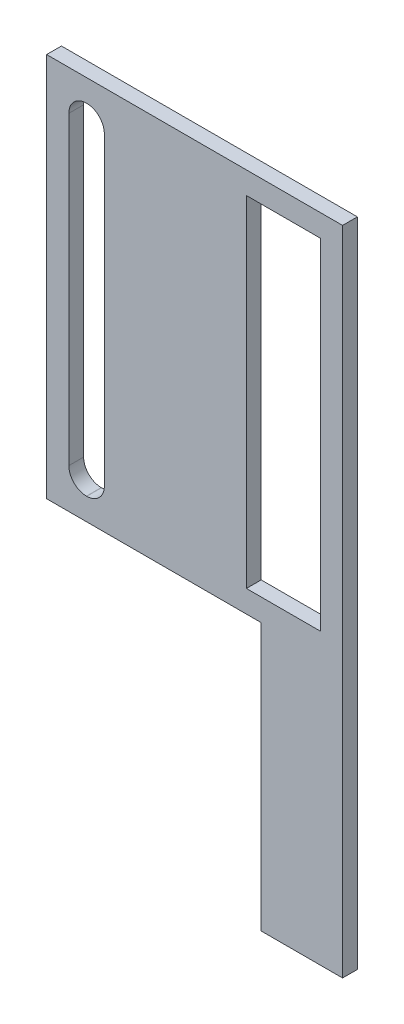
ISO-10303-21;
HEADER;
FILE_DESCRIPTION(('STEP AP214'),'2;1');
FILE_NAME('part.step','',(''),(''),'','','');
FILE_SCHEMA(('AUTOMOTIVE_DESIGN { 1 0 10303 214 1 1 1 1 }'));
ENDSEC;
DATA;
#1=APPLICATION_CONTEXT('core data for automotive mechanical design processes');
#2=APPLICATION_PROTOCOL_DEFINITION('international standard','automotive_design',2000,#1);
#3=PRODUCT_CONTEXT('',#1,'mechanical');
#4=PRODUCT('Part','Part','',(#3));
#5=PRODUCT_RELATED_PRODUCT_CATEGORY('part','',(#4));
#6=PRODUCT_DEFINITION_FORMATION('','',#4);
#7=PRODUCT_DEFINITION_CONTEXT('part definition',#1,'design');
#8=PRODUCT_DEFINITION('design','',#6,#7);
#9=PRODUCT_DEFINITION_SHAPE('','',#8);
#10=(LENGTH_UNIT() NAMED_UNIT(*) SI_UNIT(.MILLI.,.METRE.));
#11=(NAMED_UNIT(*) PLANE_ANGLE_UNIT() SI_UNIT($,.RADIAN.));
#12=(NAMED_UNIT(*) SI_UNIT($,.STERADIAN.) SOLID_ANGLE_UNIT());
#13=UNCERTAINTY_MEASURE_WITH_UNIT(LENGTH_MEASURE(1.E-05),#10,'distance_accuracy_value','');
#14=(GEOMETRIC_REPRESENTATION_CONTEXT(3) GLOBAL_UNCERTAINTY_ASSIGNED_CONTEXT((#13)) GLOBAL_UNIT_ASSIGNED_CONTEXT((#10,
#11,#12)) REPRESENTATION_CONTEXT('',''));
#15=CARTESIAN_POINT('',(0.,0.,0.));
#16=DIRECTION('',(0.,0.,1.));
#17=DIRECTION('',(1.,0.,0.));
#18=AXIS2_PLACEMENT_3D('',#15,#16,#17);
#19=CARTESIAN_POINT('',(-2.75,-19.65,1.));
#20=DIRECTION('',(1.,0.,0.));
#21=DIRECTION('',(0.,0.,-1.));
#22=AXIS2_PLACEMENT_3D('',#19,#20,#21);
#23=PLANE('',#22);
#24=DIRECTION('',(0.,-1.,0.));
#25=VECTOR('',#24,1.);
#26=CARTESIAN_POINT('',(-2.75,-19.65,1.));
#27=LINE('',#26,#25);
#28=CARTESIAN_POINT('',(-2.75,-1.6,1.));
#29=VERTEX_POINT('',#28);
#30=CARTESIAN_POINT('',(-2.75,-19.65,1.));
#31=VERTEX_POINT('',#30);
#32=EDGE_CURVE('E283',#29,#31,#27,.T.);
#33=ORIENTED_EDGE('',*,*,#32,.F.);
#34=DIRECTION('',(0.,0.,-1.));
#35=VECTOR('',#34,1.);
#36=CARTESIAN_POINT('',(-2.75,-1.6,1.));
#37=LINE('',#36,#35);
#38=CARTESIAN_POINT('',(-2.75,-1.6,0.));
#39=VERTEX_POINT('',#38);
#40=EDGE_CURVE('E280',#29,#39,#37,.T.);
#41=ORIENTED_EDGE('',*,*,#40,.T.);
#42=DIRECTION('',(0.,-1.,0.));
#43=VECTOR('',#42,1.);
#44=CARTESIAN_POINT('',(-2.75,-19.65,0.));
#45=LINE('',#44,#43);
#46=CARTESIAN_POINT('',(-2.75,-19.65,0.));
#47=VERTEX_POINT('',#46);
#48=EDGE_CURVE('E282',#39,#47,#45,.T.);
#49=ORIENTED_EDGE('',*,*,#48,.T.);
#50=DIRECTION('',(0.,0.,-1.));
#51=VECTOR('',#50,1.);
#52=CARTESIAN_POINT('',(-2.75,-19.65,1.));
#53=LINE('',#52,#51);
#54=EDGE_CURVE('E11',#31,#47,#53,.T.);
#55=ORIENTED_EDGE('',*,*,#54,.F.);
#56=EDGE_LOOP('',(#33,#41,#49,#55));
#57=FACE_BOUND('',#56,.T.);
#58=ADVANCED_FACE('F33',(#57),#23,.F.);
#59=CARTESIAN_POINT('',(2.75,-19.65,1.));
#60=DIRECTION('',(0.,1.,0.));
#61=DIRECTION('',(0.,0.,1.));
#62=AXIS2_PLACEMENT_3D('',#59,#60,#61);
#63=PLANE('',#62);
#64=DIRECTION('',(1.,0.,0.));
#65=VECTOR('',#64,1.);
#66=CARTESIAN_POINT('',(2.75,-19.65,0.));
#67=LINE('',#66,#65);
#68=CARTESIAN_POINT('',(2.75,-19.65,0.));
#69=VERTEX_POINT('',#68);
#70=EDGE_CURVE('E291',#47,#69,#67,.T.);
#71=ORIENTED_EDGE('',*,*,#70,.T.);
#72=DIRECTION('',(0.,0.,-1.));
#73=VECTOR('',#72,1.);
#74=CARTESIAN_POINT('',(2.75,-19.65,1.));
#75=LINE('',#74,#73);
#76=CARTESIAN_POINT('',(2.75,-19.65,1.));
#77=VERTEX_POINT('',#76);
#78=EDGE_CURVE('E40',#77,#69,#75,.T.);
#79=ORIENTED_EDGE('',*,*,#78,.F.);
#80=DIRECTION('',(1.,0.,0.));
#81=VECTOR('',#80,1.);
#82=CARTESIAN_POINT('',(2.75,-19.65,1.));
#83=LINE('',#82,#81);
#84=EDGE_CURVE('E285',#31,#77,#83,.T.);
#85=ORIENTED_EDGE('',*,*,#84,.F.);
#86=ORIENTED_EDGE('',*,*,#54,.T.);
#87=EDGE_LOOP('',(#71,#79,#85,#86));
#88=FACE_BOUND('',#87,.T.);
#89=ADVANCED_FACE('F316',(#88),#63,.F.);
#90=CARTESIAN_POINT('',(2.75,-19.65,1.));
#91=DIRECTION('',(-1.,0.,0.));
#92=DIRECTION('',(0.,0.,1.));
#93=AXIS2_PLACEMENT_3D('',#90,#91,#92);
#94=PLANE('',#93);
#95=DIRECTION('',(0.,1.,0.));
#96=VECTOR('',#95,1.);
#97=CARTESIAN_POINT('',(2.75,-19.65,0.));
#98=LINE('',#97,#96);
#99=CARTESIAN_POINT('',(2.75,24.4,0.));
#100=VERTEX_POINT('',#99);
#101=EDGE_CURVE('E286',#69,#100,#98,.T.);
#102=ORIENTED_EDGE('',*,*,#101,.T.);
#103=DIRECTION('',(0.,0.,1.));
#104=VECTOR('',#103,1.);
#105=CARTESIAN_POINT('',(2.75,24.4,-32.8024389337134));
#106=LINE('',#105,#104);
#107=CARTESIAN_POINT('',(2.75,24.4,1.));
#108=VERTEX_POINT('',#107);
#109=EDGE_CURVE('E272',#100,#108,#106,.T.);
#110=ORIENTED_EDGE('',*,*,#109,.T.);
#111=DIRECTION('',(0.,1.,0.));
#112=VECTOR('',#111,1.);
#113=CARTESIAN_POINT('',(2.75,-19.65,1.));
#114=LINE('',#113,#112);
#115=EDGE_CURVE('E288',#77,#108,#114,.T.);
#116=ORIENTED_EDGE('',*,*,#115,.F.);
#117=ORIENTED_EDGE('',*,*,#78,.T.);
#118=EDGE_LOOP('',(#102,#110,#116,#117));
#119=FACE_BOUND('',#118,.T.);
#120=ADVANCED_FACE('F298',(#119),#94,.F.);
#121=CARTESIAN_POINT('',(0.,0.,1.));
#122=DIRECTION('',(0.,0.,1.));
#123=DIRECTION('',(1.,0.,0.));
#124=AXIS2_PLACEMENT_3D('',#121,#122,#123);
#125=PLANE('',#124);
#126=DIRECTION('',(0.,-1.,0.));
#127=VECTOR('',#126,1.);
#128=CARTESIAN_POINT('',(-3.75,22.9,1.));
#129=LINE('',#128,#127);
#130=CARTESIAN_POINT('',(-3.75,22.9,1.));
#131=VERTEX_POINT('',#130);
#132=CARTESIAN_POINT('',(-3.75,-0.100000000000003,1.));
#133=VERTEX_POINT('',#132);
#134=EDGE_CURVE('E47',#131,#133,#129,.T.);
#135=ORIENTED_EDGE('',*,*,#134,.F.);
#136=DIRECTION('',(-1.,0.,0.));
#137=VECTOR('',#136,1.);
#138=CARTESIAN_POINT('',(-3.75,22.9,1.));
#139=LINE('',#138,#137);
#140=CARTESIAN_POINT('',(1.25,22.9,1.));
#141=VERTEX_POINT('',#140);
#142=EDGE_CURVE('E175',#141,#131,#139,.T.);
#143=ORIENTED_EDGE('',*,*,#142,.F.);
#144=DIRECTION('',(0.,1.,0.));
#145=VECTOR('',#144,1.);
#146=CARTESIAN_POINT('',(1.25,22.9,1.));
#147=LINE('',#146,#145);
#148=CARTESIAN_POINT('',(1.25,-0.100000000000004,1.));
#149=VERTEX_POINT('',#148);
#150=EDGE_CURVE('E178',#149,#141,#147,.T.);
#151=ORIENTED_EDGE('',*,*,#150,.F.);
#152=DIRECTION('',(1.,0.,0.));
#153=VECTOR('',#152,1.);
#154=CARTESIAN_POINT('',(-3.75,-0.100000000000003,1.));
#155=LINE('',#154,#153);
#156=EDGE_CURVE('E184',#133,#149,#155,.T.);
#157=ORIENTED_EDGE('',*,*,#156,.F.);
#158=EDGE_LOOP('',(#135,#143,#151,#157));
#159=FACE_BOUND('',#158,.T.);
#160=CARTESIAN_POINT('',(-14.56,1.09,1.));
#161=DIRECTION('',(0.,0.,1.));
#162=DIRECTION('',(1.,0.,0.));
#163=AXIS2_PLACEMENT_3D('',#160,#161,#162);
#164=CIRCLE('',#163,1.19);
#165=CARTESIAN_POINT('',(-15.75,1.09,1.));
#166=VERTEX_POINT('',#165);
#167=CARTESIAN_POINT('',(-14.56,-0.100000000000003,1.));
#168=VERTEX_POINT('',#167);
#169=EDGE_CURVE('E190',#166,#168,#164,.T.);
#170=ORIENTED_EDGE('',*,*,#169,.F.);
#171=DIRECTION('',(0.,-1.,0.));
#172=VECTOR('',#171,1.);
#173=CARTESIAN_POINT('',(-15.75,21.71,1.));
#174=LINE('',#173,#172);
#175=CARTESIAN_POINT('',(-15.75,21.71,1.));
#176=VERTEX_POINT('',#175);
#177=EDGE_CURVE('E198',#176,#166,#174,.T.);
#178=ORIENTED_EDGE('',*,*,#177,.F.);
#179=CARTESIAN_POINT('',(-14.56,21.71,1.));
#180=DIRECTION('',(0.,0.,1.));
#181=DIRECTION('',(1.,0.,0.));
#182=AXIS2_PLACEMENT_3D('',#179,#180,#181);
#183=CIRCLE('',#182,1.19);
#184=CARTESIAN_POINT('',(-14.56,22.9,1.));
#185=VERTEX_POINT('',#184);
#186=EDGE_CURVE('E236',#185,#176,#183,.T.);
#187=ORIENTED_EDGE('',*,*,#186,.F.);
#188=DIRECTION('',(-1.,0.,0.));
#189=VECTOR('',#188,1.);
#190=CARTESIAN_POINT('',(-14.56,22.9,1.));
#191=LINE('',#190,#189);
#192=CARTESIAN_POINT('',(-14.54,22.9,1.));
#193=VERTEX_POINT('',#192);
#194=EDGE_CURVE('E233',#193,#185,#191,.T.);
#195=ORIENTED_EDGE('',*,*,#194,.F.);
#196=CARTESIAN_POINT('',(-14.54,21.71,1.));
#197=DIRECTION('',(0.,0.,1.));
#198=DIRECTION('',(-1.,0.,0.));
#199=AXIS2_PLACEMENT_3D('',#196,#197,#198);
#200=CIRCLE('',#199,1.19);
#201=CARTESIAN_POINT('',(-13.35,21.71,1.));
#202=VERTEX_POINT('',#201);
#203=EDGE_CURVE('E230',#202,#193,#200,.T.);
#204=ORIENTED_EDGE('',*,*,#203,.F.);
#205=DIRECTION('',(0.,1.,0.));
#206=VECTOR('',#205,1.);
#207=CARTESIAN_POINT('',(-13.35,21.71,1.));
#208=LINE('',#207,#206);
#209=CARTESIAN_POINT('',(-13.35,1.09000000000001,1.));
#210=VERTEX_POINT('',#209);
#211=EDGE_CURVE('E227',#210,#202,#208,.T.);
#212=ORIENTED_EDGE('',*,*,#211,.F.);
#213=CARTESIAN_POINT('',(-14.54,1.09,1.));
#214=DIRECTION('',(0.,0.,1.));
#215=DIRECTION('',(1.,0.,0.));
#216=AXIS2_PLACEMENT_3D('',#213,#214,#215);
#217=CIRCLE('',#216,1.19);
#218=CARTESIAN_POINT('',(-14.54,-0.100000000000004,1.));
#219=VERTEX_POINT('',#218);
#220=EDGE_CURVE('E224',#219,#210,#217,.T.);
#221=ORIENTED_EDGE('',*,*,#220,.F.);
#222=DIRECTION('',(1.,0.,0.));
#223=VECTOR('',#222,1.);
#224=CARTESIAN_POINT('',(-14.56,-0.100000000000003,1.));
#225=LINE('',#224,#223);
#226=EDGE_CURVE('E221',#168,#219,#225,.T.);
#227=ORIENTED_EDGE('',*,*,#226,.F.);
#228=EDGE_LOOP('',(#170,#178,#187,#195,#204,#212,#221,#227));
#229=FACE_BOUND('',#228,.T.);
#230=DIRECTION('',(1.,0.,0.));
#231=VECTOR('',#230,1.);
#232=CARTESIAN_POINT('',(2.75,-1.6,1.));
#233=LINE('',#232,#231);
#234=CARTESIAN_POINT('',(-17.25,-1.6,1.));
#235=VERTEX_POINT('',#234);
#236=EDGE_CURVE('E269',#235,#29,#233,.T.);
#237=ORIENTED_EDGE('',*,*,#236,.T.);
#238=ORIENTED_EDGE('',*,*,#32,.T.);
#239=ORIENTED_EDGE('',*,*,#84,.T.);
#240=ORIENTED_EDGE('',*,*,#115,.T.);
#241=DIRECTION('',(-1.,0.,0.));
#242=VECTOR('',#241,1.);
#243=CARTESIAN_POINT('',(2.75,24.4,1.));
#244=LINE('',#243,#242);
#245=CARTESIAN_POINT('',(-17.25,24.4,1.));
#246=VERTEX_POINT('',#245);
#247=EDGE_CURVE('E243',#108,#246,#244,.T.);
#248=ORIENTED_EDGE('',*,*,#247,.T.);
#249=DIRECTION('',(0.,-1.,0.));
#250=VECTOR('',#249,1.);
#251=CARTESIAN_POINT('',(-17.25,-1.6,1.));
#252=LINE('',#251,#250);
#253=EDGE_CURVE('E266',#246,#235,#252,.T.);
#254=ORIENTED_EDGE('',*,*,#253,.T.);
#255=EDGE_LOOP('',(#237,#238,#239,#240,#248,#254));
#256=FACE_BOUND('',#255,.T.);
#257=ADVANCED_FACE('F313',(#159,#229,#256),#125,.T.);
#258=CARTESIAN_POINT('',(0.,0.,0.));
#259=DIRECTION('',(0.,0.,1.));
#260=DIRECTION('',(1.,0.,0.));
#261=AXIS2_PLACEMENT_3D('',#258,#259,#260);
#262=PLANE('',#261);
#263=DIRECTION('',(-1.,0.,0.));
#264=VECTOR('',#263,1.);
#265=CARTESIAN_POINT('',(-3.75,22.9,0.));
#266=LINE('',#265,#264);
#267=CARTESIAN_POINT('',(1.25,22.9,0.));
#268=VERTEX_POINT('',#267);
#269=CARTESIAN_POINT('',(-3.75,22.9,0.));
#270=VERTEX_POINT('',#269);
#271=EDGE_CURVE('E165',#268,#270,#266,.T.);
#272=ORIENTED_EDGE('',*,*,#271,.T.);
#273=DIRECTION('',(0.,-1.,0.));
#274=VECTOR('',#273,1.);
#275=CARTESIAN_POINT('',(-3.75,22.9,0.));
#276=LINE('',#275,#274);
#277=CARTESIAN_POINT('',(-3.75,-0.100000000000003,0.));
#278=VERTEX_POINT('',#277);
#279=EDGE_CURVE('E159',#270,#278,#276,.T.);
#280=ORIENTED_EDGE('',*,*,#279,.T.);
#281=DIRECTION('',(1.,0.,0.));
#282=VECTOR('',#281,1.);
#283=CARTESIAN_POINT('',(-3.75,-0.100000000000003,0.));
#284=LINE('',#283,#282);
#285=CARTESIAN_POINT('',(1.25,-0.100000000000004,0.));
#286=VERTEX_POINT('',#285);
#287=EDGE_CURVE('E168',#278,#286,#284,.T.);
#288=ORIENTED_EDGE('',*,*,#287,.T.);
#289=DIRECTION('',(0.,1.,0.));
#290=VECTOR('',#289,1.);
#291=CARTESIAN_POINT('',(1.25,22.9,0.));
#292=LINE('',#291,#290);
#293=EDGE_CURVE('E55',#286,#268,#292,.T.);
#294=ORIENTED_EDGE('',*,*,#293,.T.);
#295=EDGE_LOOP('',(#272,#280,#288,#294));
#296=FACE_BOUND('',#295,.T.);
#297=DIRECTION('',(0.,-1.,0.));
#298=VECTOR('',#297,1.);
#299=CARTESIAN_POINT('',(-15.75,21.71,0.));
#300=LINE('',#299,#298);
#301=CARTESIAN_POINT('',(-15.75,21.71,0.));
#302=VERTEX_POINT('',#301);
#303=CARTESIAN_POINT('',(-15.75,1.09,0.));
#304=VERTEX_POINT('',#303);
#305=EDGE_CURVE('E216',#302,#304,#300,.T.);
#306=ORIENTED_EDGE('',*,*,#305,.T.);
#307=CARTESIAN_POINT('',(-14.56,1.09,0.));
#308=DIRECTION('',(0.,0.,1.));
#309=DIRECTION('',(1.,0.,0.));
#310=AXIS2_PLACEMENT_3D('',#307,#308,#309);
#311=CIRCLE('',#310,1.19);
#312=CARTESIAN_POINT('',(-14.56,-0.100000000000003,0.));
#313=VERTEX_POINT('',#312);
#314=EDGE_CURVE('E194',#304,#313,#311,.T.);
#315=ORIENTED_EDGE('',*,*,#314,.T.);
#316=DIRECTION('',(1.,0.,0.));
#317=VECTOR('',#316,1.);
#318=CARTESIAN_POINT('',(-14.56,-0.100000000000003,0.));
#319=LINE('',#318,#317);
#320=CARTESIAN_POINT('',(-14.54,-0.100000000000003,0.));
#321=VERTEX_POINT('',#320);
#322=EDGE_CURVE('E197',#313,#321,#319,.T.);
#323=ORIENTED_EDGE('',*,*,#322,.T.);
#324=CARTESIAN_POINT('',(-14.54,1.09,0.));
#325=DIRECTION('',(0.,0.,1.));
#326=DIRECTION('',(1.,0.,0.));
#327=AXIS2_PLACEMENT_3D('',#324,#325,#326);
#328=CIRCLE('',#327,1.19);
#329=CARTESIAN_POINT('',(-13.35,1.09000000000001,0.));
#330=VERTEX_POINT('',#329);
#331=EDGE_CURVE('E201',#321,#330,#328,.T.);
#332=ORIENTED_EDGE('',*,*,#331,.T.);
#333=DIRECTION('',(0.,1.,0.));
#334=VECTOR('',#333,1.);
#335=CARTESIAN_POINT('',(-13.35,21.71,0.));
#336=LINE('',#335,#334);
#337=CARTESIAN_POINT('',(-13.35,21.71,0.));
#338=VERTEX_POINT('',#337);
#339=EDGE_CURVE('E204',#330,#338,#336,.T.);
#340=ORIENTED_EDGE('',*,*,#339,.T.);
#341=CARTESIAN_POINT('',(-14.54,21.71,0.));
#342=DIRECTION('',(0.,0.,1.));
#343=DIRECTION('',(-1.,0.,0.));
#344=AXIS2_PLACEMENT_3D('',#341,#342,#343);
#345=CIRCLE('',#344,1.19);
#346=CARTESIAN_POINT('',(-14.54,22.9,0.));
#347=VERTEX_POINT('',#346);
#348=EDGE_CURVE('E207',#338,#347,#345,.T.);
#349=ORIENTED_EDGE('',*,*,#348,.T.);
#350=DIRECTION('',(-1.,0.,0.));
#351=VECTOR('',#350,1.);
#352=CARTESIAN_POINT('',(-14.56,22.9,0.));
#353=LINE('',#352,#351);
#354=CARTESIAN_POINT('',(-14.56,22.9,0.));
#355=VERTEX_POINT('',#354);
#356=EDGE_CURVE('E210',#347,#355,#353,.T.);
#357=ORIENTED_EDGE('',*,*,#356,.T.);
#358=CARTESIAN_POINT('',(-14.56,21.71,0.));
#359=DIRECTION('',(0.,0.,1.));
#360=DIRECTION('',(1.,0.,0.));
#361=AXIS2_PLACEMENT_3D('',#358,#359,#360);
#362=CIRCLE('',#361,1.19);
#363=EDGE_CURVE('E213',#355,#302,#362,.T.);
#364=ORIENTED_EDGE('',*,*,#363,.T.);
#365=EDGE_LOOP('',(#306,#315,#323,#332,#340,#349,#357,#364));
#366=FACE_BOUND('',#365,.T.);
#367=ORIENTED_EDGE('',*,*,#48,.F.);
#368=DIRECTION('',(-1.,0.,0.));
#369=VECTOR('',#368,1.);
#370=CARTESIAN_POINT('',(2.75,-1.6,0.));
#371=LINE('',#370,#369);
#372=CARTESIAN_POINT('',(-17.25,-1.6,0.));
#373=VERTEX_POINT('',#372);
#374=EDGE_CURVE('E260',#39,#373,#371,.T.);
#375=ORIENTED_EDGE('',*,*,#374,.T.);
#376=DIRECTION('',(0.,1.,0.));
#377=VECTOR('',#376,1.);
#378=CARTESIAN_POINT('',(-17.25,-1.6,0.));
#379=LINE('',#378,#377);
#380=CARTESIAN_POINT('',(-17.25,24.4,0.));
#381=VERTEX_POINT('',#380);
#382=EDGE_CURVE('E258',#373,#381,#379,.T.);
#383=ORIENTED_EDGE('',*,*,#382,.T.);
#384=DIRECTION('',(1.,0.,0.));
#385=VECTOR('',#384,1.);
#386=CARTESIAN_POINT('',(2.75,24.4,0.));
#387=LINE('',#386,#385);
#388=EDGE_CURVE('E263',#381,#100,#387,.T.);
#389=ORIENTED_EDGE('',*,*,#388,.T.);
#390=ORIENTED_EDGE('',*,*,#101,.F.);
#391=ORIENTED_EDGE('',*,*,#70,.F.);
#392=EDGE_LOOP('',(#367,#375,#383,#389,#390,#391));
#393=FACE_BOUND('',#392,.T.);
#394=ADVANCED_FACE('F172',(#296,#366,#393),#262,.F.);
#395=CARTESIAN_POINT('',(2.75,-1.6,-32.8024389337134));
#396=DIRECTION('',(0.,-1.,0.));
#397=DIRECTION('',(1.,0.,0.));
#398=AXIS2_PLACEMENT_3D('',#395,#396,#397);
#399=PLANE('',#398);
#400=ORIENTED_EDGE('',*,*,#40,.F.);
#401=ORIENTED_EDGE('',*,*,#236,.F.);
#402=DIRECTION('',(0.,0.,1.));
#403=VECTOR('',#402,1.);
#404=CARTESIAN_POINT('',(-17.25,-1.6,-32.8024389337134));
#405=LINE('',#404,#403);
#406=EDGE_CURVE('E261',#373,#235,#405,.T.);
#407=ORIENTED_EDGE('',*,*,#406,.F.);
#408=ORIENTED_EDGE('',*,*,#374,.F.);
#409=EDGE_LOOP('',(#400,#401,#407,#408));
#410=FACE_BOUND('',#409,.T.);
#411=ADVANCED_FACE('F322',(#410),#399,.T.);
#412=CARTESIAN_POINT('',(-17.25,-1.6,-32.8024389337134));
#413=DIRECTION('',(-1.,0.,0.));
#414=DIRECTION('',(0.,0.,1.));
#415=AXIS2_PLACEMENT_3D('',#412,#413,#414);
#416=PLANE('',#415);
#417=ORIENTED_EDGE('',*,*,#382,.F.);
#418=ORIENTED_EDGE('',*,*,#406,.T.);
#419=ORIENTED_EDGE('',*,*,#253,.F.);
#420=DIRECTION('',(0.,0.,1.));
#421=VECTOR('',#420,1.);
#422=CARTESIAN_POINT('',(-17.25,24.4,-32.8024389337134));
#423=LINE('',#422,#421);
#424=EDGE_CURVE('E274',#381,#246,#423,.T.);
#425=ORIENTED_EDGE('',*,*,#424,.F.);
#426=EDGE_LOOP('',(#417,#418,#419,#425));
#427=FACE_BOUND('',#426,.T.);
#428=ADVANCED_FACE('F324',(#427),#416,.T.);
#429=CARTESIAN_POINT('',(2.75,24.4,-32.8024389337134));
#430=DIRECTION('',(0.,1.,0.));
#431=DIRECTION('',(-1.,0.,0.));
#432=AXIS2_PLACEMENT_3D('',#429,#430,#431);
#433=PLANE('',#432);
#434=ORIENTED_EDGE('',*,*,#388,.F.);
#435=ORIENTED_EDGE('',*,*,#424,.T.);
#436=ORIENTED_EDGE('',*,*,#247,.F.);
#437=ORIENTED_EDGE('',*,*,#109,.F.);
#438=EDGE_LOOP('',(#434,#435,#436,#437));
#439=FACE_BOUND('',#438,.T.);
#440=ADVANCED_FACE('F310',(#439),#433,.T.);
#441=CARTESIAN_POINT('',(-14.56,1.09,0.));
#442=DIRECTION('',(0.,0.,1.));
#443=DIRECTION('',(1.,0.,0.));
#444=AXIS2_PLACEMENT_3D('',#441,#442,#443);
#445=CYLINDRICAL_SURFACE('',#444,1.19);
#446=ORIENTED_EDGE('',*,*,#169,.T.);
#447=DIRECTION('',(0.,0.,1.));
#448=VECTOR('',#447,1.);
#449=CARTESIAN_POINT('',(-14.56,-0.100000000000003,0.));
#450=LINE('',#449,#448);
#451=EDGE_CURVE('E219',#313,#168,#450,.T.);
#452=ORIENTED_EDGE('',*,*,#451,.F.);
#453=ORIENTED_EDGE('',*,*,#314,.F.);
#454=DIRECTION('',(0.,0.,1.));
#455=VECTOR('',#454,1.);
#456=CARTESIAN_POINT('',(-15.75,1.09,0.));
#457=LINE('',#456,#455);
#458=EDGE_CURVE('E241',#304,#166,#457,.T.);
#459=ORIENTED_EDGE('',*,*,#458,.T.);
#460=EDGE_LOOP('',(#446,#452,#453,#459));
#461=FACE_BOUND('',#460,.T.);
#462=ADVANCED_FACE('F331',(#461),#445,.F.);
#463=CARTESIAN_POINT('',(-15.75,21.71,0.));
#464=DIRECTION('',(-1.,0.,0.));
#465=DIRECTION('',(0.,-1.,0.));
#466=AXIS2_PLACEMENT_3D('',#463,#464,#465);
#467=PLANE('',#466);
#468=ORIENTED_EDGE('',*,*,#177,.T.);
#469=ORIENTED_EDGE('',*,*,#458,.F.);
#470=ORIENTED_EDGE('',*,*,#305,.F.);
#471=DIRECTION('',(0.,0.,1.));
#472=VECTOR('',#471,1.);
#473=CARTESIAN_POINT('',(-15.75,21.71,0.));
#474=LINE('',#473,#472);
#475=EDGE_CURVE('E244',#302,#176,#474,.T.);
#476=ORIENTED_EDGE('',*,*,#475,.T.);
#477=EDGE_LOOP('',(#468,#469,#470,#476));
#478=FACE_BOUND('',#477,.T.);
#479=ADVANCED_FACE('F365',(#478),#467,.F.);
#480=CARTESIAN_POINT('',(-14.56,21.71,0.));
#481=DIRECTION('',(0.,0.,1.));
#482=DIRECTION('',(1.,0.,0.));
#483=AXIS2_PLACEMENT_3D('',#480,#481,#482);
#484=CYLINDRICAL_SURFACE('',#483,1.19);
#485=ORIENTED_EDGE('',*,*,#186,.T.);
#486=ORIENTED_EDGE('',*,*,#475,.F.);
#487=ORIENTED_EDGE('',*,*,#363,.F.);
#488=DIRECTION('',(0.,0.,1.));
#489=VECTOR('',#488,1.);
#490=CARTESIAN_POINT('',(-14.56,22.9,0.));
#491=LINE('',#490,#489);
#492=EDGE_CURVE('E246',#355,#185,#491,.T.);
#493=ORIENTED_EDGE('',*,*,#492,.T.);
#494=EDGE_LOOP('',(#485,#486,#487,#493));
#495=FACE_BOUND('',#494,.T.);
#496=ADVANCED_FACE('F367',(#495),#484,.F.);
#497=CARTESIAN_POINT('',(-14.56,22.9,0.));
#498=DIRECTION('',(0.,1.,0.));
#499=DIRECTION('',(0.,0.,1.));
#500=AXIS2_PLACEMENT_3D('',#497,#498,#499);
#501=PLANE('',#500);
#502=ORIENTED_EDGE('',*,*,#194,.T.);
#503=ORIENTED_EDGE('',*,*,#492,.F.);
#504=ORIENTED_EDGE('',*,*,#356,.F.);
#505=DIRECTION('',(0.,0.,1.));
#506=VECTOR('',#505,1.);
#507=CARTESIAN_POINT('',(-14.54,22.9,0.));
#508=LINE('',#507,#506);
#509=EDGE_CURVE('E248',#347,#193,#508,.T.);
#510=ORIENTED_EDGE('',*,*,#509,.T.);
#511=EDGE_LOOP('',(#502,#503,#504,#510));
#512=FACE_BOUND('',#511,.T.);
#513=ADVANCED_FACE('F372',(#512),#501,.F.);
#514=CARTESIAN_POINT('',(-14.54,21.71,0.));
#515=DIRECTION('',(0.,0.,1.));
#516=DIRECTION('',(1.,0.,0.));
#517=AXIS2_PLACEMENT_3D('',#514,#515,#516);
#518=CYLINDRICAL_SURFACE('',#517,1.19);
#519=ORIENTED_EDGE('',*,*,#203,.T.);
#520=ORIENTED_EDGE('',*,*,#509,.F.);
#521=ORIENTED_EDGE('',*,*,#348,.F.);
#522=DIRECTION('',(0.,0.,1.));
#523=VECTOR('',#522,1.);
#524=CARTESIAN_POINT('',(-13.35,21.71,0.));
#525=LINE('',#524,#523);
#526=EDGE_CURVE('E250',#338,#202,#525,.T.);
#527=ORIENTED_EDGE('',*,*,#526,.T.);
#528=EDGE_LOOP('',(#519,#520,#521,#527));
#529=FACE_BOUND('',#528,.T.);
#530=ADVANCED_FACE('F376',(#529),#518,.F.);
#531=CARTESIAN_POINT('',(-13.35,21.71,0.));
#532=DIRECTION('',(1.,0.,0.));
#533=DIRECTION('',(0.,1.,0.));
#534=AXIS2_PLACEMENT_3D('',#531,#532,#533);
#535=PLANE('',#534);
#536=ORIENTED_EDGE('',*,*,#211,.T.);
#537=ORIENTED_EDGE('',*,*,#526,.F.);
#538=ORIENTED_EDGE('',*,*,#339,.F.);
#539=DIRECTION('',(0.,0.,1.));
#540=VECTOR('',#539,1.);
#541=CARTESIAN_POINT('',(-13.35,1.09000000000001,0.));
#542=LINE('',#541,#540);
#543=EDGE_CURVE('E252',#330,#210,#542,.T.);
#544=ORIENTED_EDGE('',*,*,#543,.T.);
#545=EDGE_LOOP('',(#536,#537,#538,#544));
#546=FACE_BOUND('',#545,.T.);
#547=ADVANCED_FACE('F379',(#546),#535,.F.);
#548=CARTESIAN_POINT('',(-14.54,1.09,0.));
#549=DIRECTION('',(0.,0.,1.));
#550=DIRECTION('',(1.,0.,0.));
#551=AXIS2_PLACEMENT_3D('',#548,#549,#550);
#552=CYLINDRICAL_SURFACE('',#551,1.19);
#553=ORIENTED_EDGE('',*,*,#220,.T.);
#554=ORIENTED_EDGE('',*,*,#543,.F.);
#555=ORIENTED_EDGE('',*,*,#331,.F.);
#556=DIRECTION('',(0.,0.,1.));
#557=VECTOR('',#556,1.);
#558=CARTESIAN_POINT('',(-14.54,-0.100000000000004,0.));
#559=LINE('',#558,#557);
#560=EDGE_CURVE('E254',#321,#219,#559,.T.);
#561=ORIENTED_EDGE('',*,*,#560,.T.);
#562=EDGE_LOOP('',(#553,#554,#555,#561));
#563=FACE_BOUND('',#562,.T.);
#564=ADVANCED_FACE('F381',(#563),#552,.F.);
#565=CARTESIAN_POINT('',(-14.56,-0.100000000000003,0.));
#566=DIRECTION('',(0.,-1.,0.));
#567=DIRECTION('',(1.,0.,0.));
#568=AXIS2_PLACEMENT_3D('',#565,#566,#567);
#569=PLANE('',#568);
#570=ORIENTED_EDGE('',*,*,#226,.T.);
#571=ORIENTED_EDGE('',*,*,#560,.F.);
#572=ORIENTED_EDGE('',*,*,#322,.F.);
#573=ORIENTED_EDGE('',*,*,#451,.T.);
#574=EDGE_LOOP('',(#570,#571,#572,#573));
#575=FACE_BOUND('',#574,.T.);
#576=ADVANCED_FACE('F360',(#575),#569,.F.);
#577=CARTESIAN_POINT('',(-3.75,22.9,0.));
#578=DIRECTION('',(-1.,0.,0.));
#579=DIRECTION('',(0.,0.,1.));
#580=AXIS2_PLACEMENT_3D('',#577,#578,#579);
#581=PLANE('',#580);
#582=ORIENTED_EDGE('',*,*,#134,.T.);
#583=DIRECTION('',(0.,0.,1.));
#584=VECTOR('',#583,1.);
#585=CARTESIAN_POINT('',(-3.75,-0.100000000000003,0.));
#586=LINE('',#585,#584);
#587=EDGE_CURVE('E155',#278,#133,#586,.T.);
#588=ORIENTED_EDGE('',*,*,#587,.F.);
#589=ORIENTED_EDGE('',*,*,#279,.F.);
#590=DIRECTION('',(0.,0.,1.));
#591=VECTOR('',#590,1.);
#592=CARTESIAN_POINT('',(-3.75,22.9,0.));
#593=LINE('',#592,#591);
#594=EDGE_CURVE('E188',#270,#131,#593,.T.);
#595=ORIENTED_EDGE('',*,*,#594,.T.);
#596=EDGE_LOOP('',(#582,#588,#589,#595));
#597=FACE_BOUND('',#596,.T.);
#598=ADVANCED_FACE('F157',(#597),#581,.F.);
#599=CARTESIAN_POINT('',(-3.75,22.9,0.));
#600=DIRECTION('',(0.,1.,0.));
#601=DIRECTION('',(0.,0.,1.));
#602=AXIS2_PLACEMENT_3D('',#599,#600,#601);
#603=PLANE('',#602);
#604=ORIENTED_EDGE('',*,*,#142,.T.);
#605=ORIENTED_EDGE('',*,*,#594,.F.);
#606=ORIENTED_EDGE('',*,*,#271,.F.);
#607=DIRECTION('',(0.,0.,1.));
#608=VECTOR('',#607,1.);
#609=CARTESIAN_POINT('',(1.25,22.9,0.));
#610=LINE('',#609,#608);
#611=EDGE_CURVE('E191',#268,#141,#610,.T.);
#612=ORIENTED_EDGE('',*,*,#611,.T.);
#613=EDGE_LOOP('',(#604,#605,#606,#612));
#614=FACE_BOUND('',#613,.T.);
#615=ADVANCED_FACE('F447',(#614),#603,.F.);
#616=CARTESIAN_POINT('',(1.25,22.9,0.));
#617=DIRECTION('',(1.,0.,0.));
#618=DIRECTION('',(0.,1.,0.));
#619=AXIS2_PLACEMENT_3D('',#616,#617,#618);
#620=PLANE('',#619);
#621=ORIENTED_EDGE('',*,*,#150,.T.);
#622=ORIENTED_EDGE('',*,*,#611,.F.);
#623=ORIENTED_EDGE('',*,*,#293,.F.);
#624=DIRECTION('',(0.,0.,1.));
#625=VECTOR('',#624,1.);
#626=CARTESIAN_POINT('',(1.25,-0.100000000000004,0.));
#627=LINE('',#626,#625);
#628=EDGE_CURVE('E164',#286,#149,#627,.T.);
#629=ORIENTED_EDGE('',*,*,#628,.T.);
#630=EDGE_LOOP('',(#621,#622,#623,#629));
#631=FACE_BOUND('',#630,.T.);
#632=ADVANCED_FACE('F455',(#631),#620,.F.);
#633=CARTESIAN_POINT('',(-3.75,-0.100000000000003,0.));
#634=DIRECTION('',(0.,-1.,0.));
#635=DIRECTION('',(1.,0.,0.));
#636=AXIS2_PLACEMENT_3D('',#633,#634,#635);
#637=PLANE('',#636);
#638=ORIENTED_EDGE('',*,*,#156,.T.);
#639=ORIENTED_EDGE('',*,*,#628,.F.);
#640=ORIENTED_EDGE('',*,*,#287,.F.);
#641=ORIENTED_EDGE('',*,*,#587,.T.);
#642=EDGE_LOOP('',(#638,#639,#640,#641));
#643=FACE_BOUND('',#642,.T.);
#644=ADVANCED_FACE('F169',(#643),#637,.F.);
#645=CLOSED_SHELL('',(#58,#89,#120,#257,#394,#411,#428,#440,#462,#479,#496,#513,#530,#547,#564,
#576,#598,#615,#632,#644));
#646=MANIFOLD_SOLID_BREP('B2',#645);
#647=ADVANCED_BREP_SHAPE_REPRESENTATION('',(#18,#646),#14);
#648=SHAPE_DEFINITION_REPRESENTATION(#9,#647);
ENDSEC;
END-ISO-10303-21;
